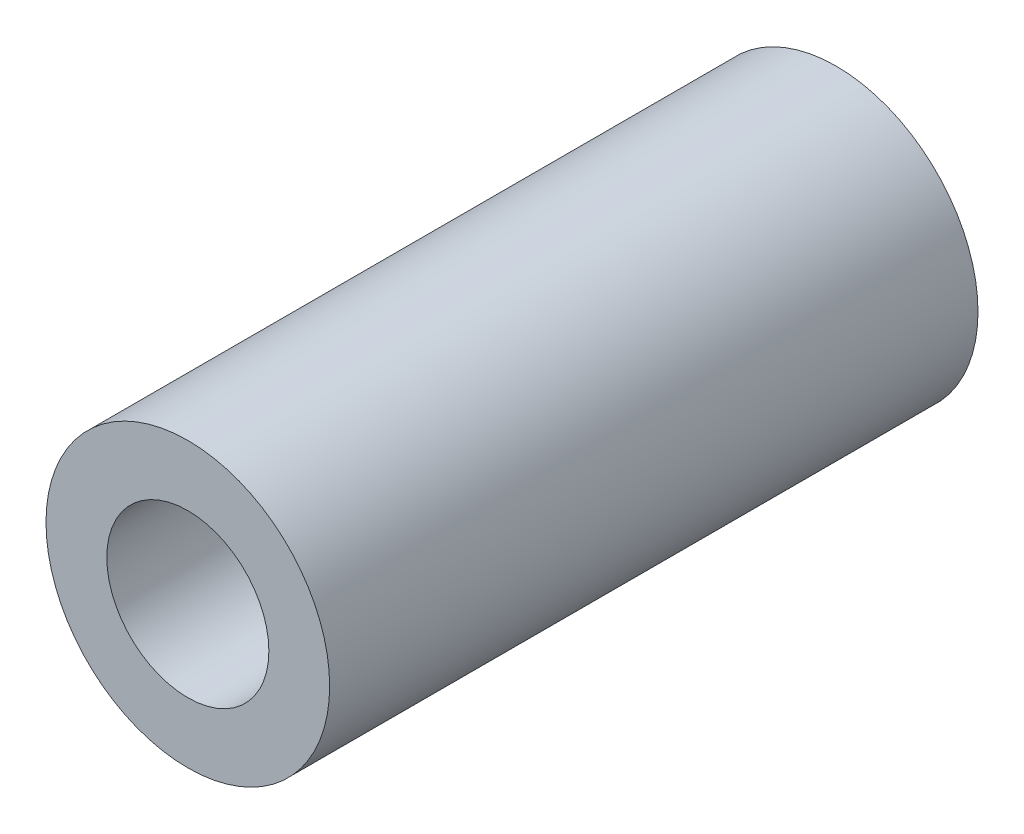
ISO-10303-21;
HEADER;
FILE_DESCRIPTION(('STEP AP214'),'2;1');
FILE_NAME('part.step','',(''),(''),'','','');
FILE_SCHEMA(('AUTOMOTIVE_DESIGN { 1 0 10303 214 1 1 1 1 }'));
ENDSEC;
DATA;
#1=APPLICATION_CONTEXT('core data for automotive mechanical design processes');
#2=APPLICATION_PROTOCOL_DEFINITION('international standard','automotive_design',2000,#1);
#3=PRODUCT_CONTEXT('',#1,'mechanical');
#4=PRODUCT('Part','Part','',(#3));
#5=PRODUCT_RELATED_PRODUCT_CATEGORY('part','',(#4));
#6=PRODUCT_DEFINITION_FORMATION('','',#4);
#7=PRODUCT_DEFINITION_CONTEXT('part definition',#1,'design');
#8=PRODUCT_DEFINITION('design','',#6,#7);
#9=PRODUCT_DEFINITION_SHAPE('','',#8);
#10=(LENGTH_UNIT() NAMED_UNIT(*) SI_UNIT(.MILLI.,.METRE.));
#11=(NAMED_UNIT(*) PLANE_ANGLE_UNIT() SI_UNIT($,.RADIAN.));
#12=(NAMED_UNIT(*) SI_UNIT($,.STERADIAN.) SOLID_ANGLE_UNIT());
#13=UNCERTAINTY_MEASURE_WITH_UNIT(LENGTH_MEASURE(1.E-05),#10,'distance_accuracy_value','');
#14=(GEOMETRIC_REPRESENTATION_CONTEXT(3) GLOBAL_UNCERTAINTY_ASSIGNED_CONTEXT((#13)) GLOBAL_UNIT_ASSIGNED_CONTEXT((#10,
#11,#12)) REPRESENTATION_CONTEXT('',''));
#15=CARTESIAN_POINT('',(0.,0.,0.));
#16=DIRECTION('',(0.,0.,1.));
#17=DIRECTION('',(1.,0.,0.));
#18=AXIS2_PLACEMENT_3D('',#15,#16,#17);
#19=CARTESIAN_POINT('',(0.,1.61043123543124,1.999996));
#20=DIRECTION('',(0.,0.,-1.));
#21=DIRECTION('',(-1.,0.,0.));
#22=AXIS2_PLACEMENT_3D('',#19,#20,#21);
#23=PLANE('',#22);
#24=CARTESIAN_POINT('',(0.,0.735431235431235,1.999996));
#25=DIRECTION('',(0.,0.,1.));
#26=DIRECTION('',(1.,0.,0.));
#27=AXIS2_PLACEMENT_3D('',#24,#25,#26);
#28=CIRCLE('',#27,0.5);
#29=CARTESIAN_POINT('',(0.5,0.735431235431235,1.999996));
#30=VERTEX_POINT('',#29);
#31=EDGE_CURVE('E10',#30,#30,#28,.T.);
#32=ORIENTED_EDGE('',*,*,#31,.F.);
#33=EDGE_LOOP('',(#32));
#34=FACE_BOUND('',#33,.T.);
#35=CARTESIAN_POINT('',(0.,0.735431235431235,1.999996));
#36=DIRECTION('',(0.,0.,1.));
#37=DIRECTION('',(1.,0.,0.));
#38=AXIS2_PLACEMENT_3D('',#35,#36,#37);
#39=CIRCLE('',#38,0.875);
#40=CARTESIAN_POINT('',(0.875,0.735431235431235,1.999996));
#41=VERTEX_POINT('',#40);
#42=EDGE_CURVE('E54',#41,#41,#39,.T.);
#43=ORIENTED_EDGE('',*,*,#42,.T.);
#44=EDGE_LOOP('',(#43));
#45=FACE_BOUND('',#44,.T.);
#46=ADVANCED_FACE('F37',(#34,#45),#23,.F.);
#47=CARTESIAN_POINT('',(0.,0.735431235431235,0.));
#48=DIRECTION('',(0.,0.,1.));
#49=DIRECTION('',(1.,0.,0.));
#50=AXIS2_PLACEMENT_3D('',#47,#48,#49);
#51=CYLINDRICAL_SURFACE('',#50,0.5);
#52=CARTESIAN_POINT('',(0.,0.735431235431235,-1.999996));
#53=DIRECTION('',(0.,0.,1.));
#54=DIRECTION('',(1.,0.,0.));
#55=AXIS2_PLACEMENT_3D('',#52,#53,#54);
#56=CIRCLE('',#55,0.5);
#57=CARTESIAN_POINT('',(0.5,0.735431235431235,-1.999996));
#58=VERTEX_POINT('',#57);
#59=EDGE_CURVE('E44',#58,#58,#56,.T.);
#60=ORIENTED_EDGE('',*,*,#59,.F.);
#61=EDGE_LOOP('',(#60));
#62=FACE_BOUND('',#61,.T.);
#63=ORIENTED_EDGE('',*,*,#31,.T.);
#64=EDGE_LOOP('',(#63));
#65=FACE_BOUND('',#64,.T.);
#66=ADVANCED_FACE('F70',(#62,#65),#51,.F.);
#67=CARTESIAN_POINT('',(0.,1.61043123543124,-1.999996));
#68=DIRECTION('',(0.,0.,1.));
#69=DIRECTION('',(1.,0.,0.));
#70=AXIS2_PLACEMENT_3D('',#67,#68,#69);
#71=PLANE('',#70);
#72=CARTESIAN_POINT('',(0.,0.735431235431235,-1.999996));
#73=DIRECTION('',(0.,0.,1.));
#74=DIRECTION('',(1.,0.,0.));
#75=AXIS2_PLACEMENT_3D('',#72,#73,#74);
#76=CIRCLE('',#75,0.875);
#77=CARTESIAN_POINT('',(0.875,0.735431235431235,-1.999996));
#78=VERTEX_POINT('',#77);
#79=EDGE_CURVE('E49',#78,#78,#76,.T.);
#80=ORIENTED_EDGE('',*,*,#79,.F.);
#81=EDGE_LOOP('',(#80));
#82=FACE_BOUND('',#81,.T.);
#83=ORIENTED_EDGE('',*,*,#59,.T.);
#84=EDGE_LOOP('',(#83));
#85=FACE_BOUND('',#84,.T.);
#86=ADVANCED_FACE('F65',(#82,#85),#71,.F.);
#87=CARTESIAN_POINT('',(0.,0.735431235431235,0.));
#88=DIRECTION('',(0.,0.,1.));
#89=DIRECTION('',(1.,0.,0.));
#90=AXIS2_PLACEMENT_3D('',#87,#88,#89);
#91=CYLINDRICAL_SURFACE('',#90,0.875);
#92=ORIENTED_EDGE('',*,*,#42,.F.);
#93=EDGE_LOOP('',(#92));
#94=FACE_BOUND('',#93,.T.);
#95=ORIENTED_EDGE('',*,*,#79,.T.);
#96=EDGE_LOOP('',(#95));
#97=FACE_BOUND('',#96,.T.);
#98=ADVANCED_FACE('F62',(#94,#97),#91,.T.);
#99=CLOSED_SHELL('',(#46,#66,#86,#98));
#100=MANIFOLD_SOLID_BREP('B2',#99);
#101=ADVANCED_BREP_SHAPE_REPRESENTATION('',(#18,#100),#14);
#102=SHAPE_DEFINITION_REPRESENTATION(#9,#101);
ENDSEC;
END-ISO-10303-21;
